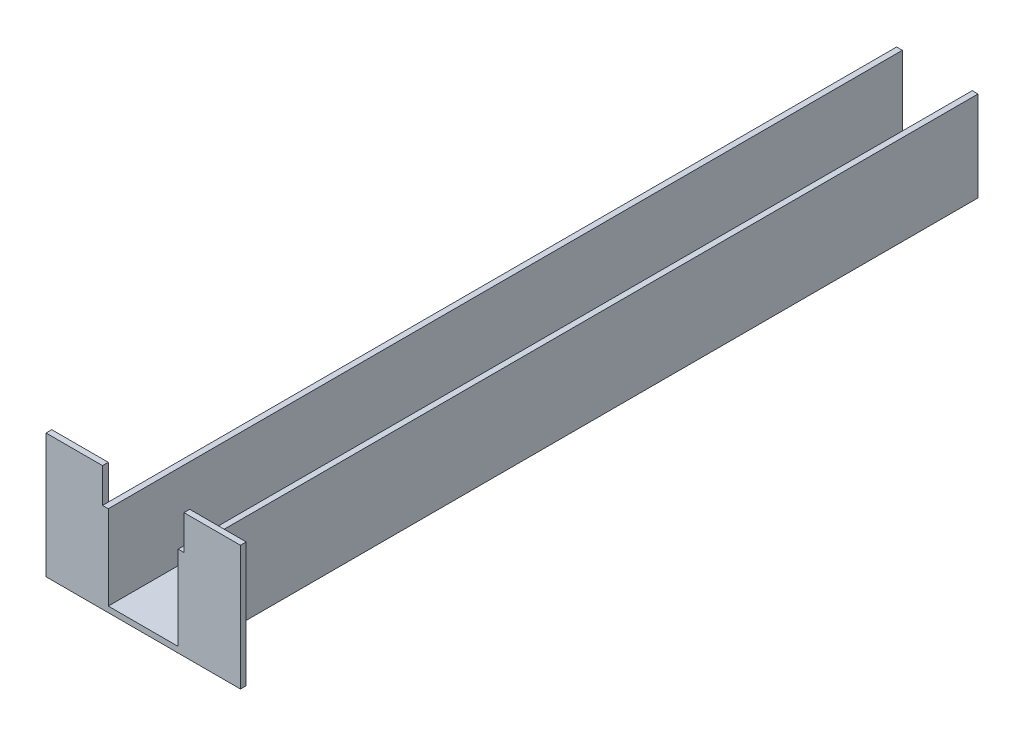
ISO-10303-21;
HEADER;
FILE_DESCRIPTION(('STEP AP214'),'2;1');
FILE_NAME('part.step','',(''),(''),'','','');
FILE_SCHEMA(('AUTOMOTIVE_DESIGN { 1 0 10303 214 1 1 1 1 }'));
ENDSEC;
DATA;
#1=APPLICATION_CONTEXT('core data for automotive mechanical design processes');
#2=APPLICATION_PROTOCOL_DEFINITION('international standard','automotive_design',2000,#1);
#3=PRODUCT_CONTEXT('',#1,'mechanical');
#4=PRODUCT('Part','Part','',(#3));
#5=PRODUCT_RELATED_PRODUCT_CATEGORY('part','',(#4));
#6=PRODUCT_DEFINITION_FORMATION('','',#4);
#7=PRODUCT_DEFINITION_CONTEXT('part definition',#1,'design');
#8=PRODUCT_DEFINITION('design','',#6,#7);
#9=PRODUCT_DEFINITION_SHAPE('','',#8);
#10=(LENGTH_UNIT() NAMED_UNIT(*) SI_UNIT(.MILLI.,.METRE.));
#11=(NAMED_UNIT(*) PLANE_ANGLE_UNIT() SI_UNIT($,.RADIAN.));
#12=(NAMED_UNIT(*) SI_UNIT($,.STERADIAN.) SOLID_ANGLE_UNIT());
#13=UNCERTAINTY_MEASURE_WITH_UNIT(LENGTH_MEASURE(1.E-05),#10,'distance_accuracy_value','');
#14=(GEOMETRIC_REPRESENTATION_CONTEXT(3) GLOBAL_UNCERTAINTY_ASSIGNED_CONTEXT((#13)) GLOBAL_UNIT_ASSIGNED_CONTEXT((#10,
#11,#12)) REPRESENTATION_CONTEXT('',''));
#15=CARTESIAN_POINT('',(0.,0.,0.));
#16=DIRECTION('',(0.,0.,1.));
#17=DIRECTION('',(1.,0.,0.));
#18=AXIS2_PLACEMENT_3D('',#15,#16,#17);
#19=CARTESIAN_POINT('',(-10.795,23.876,210.566));
#20=DIRECTION('',(0.,-1.,0.));
#21=DIRECTION('',(0.,0.,-1.));
#22=AXIS2_PLACEMENT_3D('',#19,#20,#21);
#23=PLANE('',#22);
#24=DIRECTION('',(0.,0.,1.));
#25=VECTOR('',#24,1.);
#26=CARTESIAN_POINT('',(-10.795,23.876,104.521));
#27=LINE('',#26,#25);
#28=CARTESIAN_POINT('',(-10.795,23.876,0.));
#29=VERTEX_POINT('',#28);
#30=CARTESIAN_POINT('',(-10.795,23.8759999996825,209.041999969012));
#31=VERTEX_POINT('',#30);
#32=EDGE_CURVE('E140',#29,#31,#27,.T.);
#33=ORIENTED_EDGE('',*,*,#32,.T.);
#34=DIRECTION('',(0.,0.,-1.));
#35=VECTOR('',#34,1.);
#36=CARTESIAN_POINT('',(-10.795,23.876,209.804));
#37=LINE('',#36,#35);
#38=CARTESIAN_POINT('',(-10.795000001143,23.875999999365,210.566));
#39=VERTEX_POINT('',#38);
#40=EDGE_CURVE('E128',#39,#31,#37,.T.);
#41=ORIENTED_EDGE('',*,*,#40,.F.);
#42=DIRECTION('',(-1.,0.,0.));
#43=VECTOR('',#42,1.);
#44=CARTESIAN_POINT('',(-10.033,23.876,210.566));
#45=LINE('',#44,#43);
#46=CARTESIAN_POINT('',(-9.271000004318,23.875999999365,210.566));
#47=VERTEX_POINT('',#46);
#48=EDGE_CURVE('E20',#47,#39,#45,.T.);
#49=ORIENTED_EDGE('',*,*,#48,.F.);
#50=DIRECTION('',(0.,0.,-1.));
#51=VECTOR('',#50,1.);
#52=CARTESIAN_POINT('',(-9.271,23.876,105.283));
#53=LINE('',#52,#51);
#54=CARTESIAN_POINT('',(-9.2710000015875,23.876,0.));
#55=VERTEX_POINT('',#54);
#56=EDGE_CURVE('E169',#47,#55,#53,.T.);
#57=ORIENTED_EDGE('',*,*,#56,.T.);
#58=DIRECTION('',(1.,0.,0.));
#59=VECTOR('',#58,1.);
#60=CARTESIAN_POINT('',(-10.033,23.876,0.));
#61=LINE('',#60,#59);
#62=EDGE_CURVE('E142',#29,#55,#61,.T.);
#63=ORIENTED_EDGE('',*,*,#62,.F.);
#64=EDGE_LOOP('',(#33,#41,#49,#57,#63));
#65=FACE_BOUND('',#64,.T.);
#66=ADVANCED_FACE('F16',(#65),#23,.F.);
#67=CARTESIAN_POINT('',(-25.781,33.02,209.042));
#68=DIRECTION('',(1.,0.,0.));
#69=DIRECTION('',(0.,0.,1.));
#70=AXIS2_PLACEMENT_3D('',#67,#68,#69);
#71=PLANE('',#70);
#72=DIRECTION('',(0.,0.,1.));
#73=VECTOR('',#72,1.);
#74=CARTESIAN_POINT('',(-25.781,33.02,209.804));
#75=LINE('',#74,#73);
#76=CARTESIAN_POINT('',(-25.781,33.02,209.042));
#77=VERTEX_POINT('',#76);
#78=CARTESIAN_POINT('',(-25.781,33.02,210.566));
#79=VERTEX_POINT('',#78);
#80=EDGE_CURVE('E137',#77,#79,#75,.T.);
#81=ORIENTED_EDGE('',*,*,#80,.F.);
#82=DIRECTION('',(0.,1.,0.));
#83=VECTOR('',#82,1.);
#84=CARTESIAN_POINT('',(-25.781,16.51,209.042));
#85=LINE('',#84,#83);
#86=CARTESIAN_POINT('',(-25.781,0.,209.041999984506));
#87=VERTEX_POINT('',#86);
#88=EDGE_CURVE('E121',#87,#77,#85,.T.);
#89=ORIENTED_EDGE('',*,*,#88,.F.);
#90=DIRECTION('',(0.,0.,-1.));
#91=VECTOR('',#90,1.);
#92=CARTESIAN_POINT('',(-25.781,0.,209.804));
#93=LINE('',#92,#91);
#94=CARTESIAN_POINT('',(-25.781,0.,210.566));
#95=VERTEX_POINT('',#94);
#96=EDGE_CURVE('E173',#95,#87,#93,.T.);
#97=ORIENTED_EDGE('',*,*,#96,.F.);
#98=DIRECTION('',(0.,1.,0.));
#99=VECTOR('',#98,1.);
#100=CARTESIAN_POINT('',(-25.781,16.51,210.566));
#101=LINE('',#100,#99);
#102=EDGE_CURVE('E155',#95,#79,#101,.T.);
#103=ORIENTED_EDGE('',*,*,#102,.T.);
#104=EDGE_LOOP('',(#81,#89,#97,#103));
#105=FACE_BOUND('',#104,.T.);
#106=ADVANCED_FACE('F230',(#105),#71,.F.);
#107=CARTESIAN_POINT('',(-25.781,33.02,209.042));
#108=DIRECTION('',(0.,1.,0.));
#109=DIRECTION('',(0.,0.,1.));
#110=AXIS2_PLACEMENT_3D('',#107,#108,#109);
#111=PLANE('',#110);
#112=ORIENTED_EDGE('',*,*,#80,.T.);
#113=DIRECTION('',(1.,0.,0.));
#114=VECTOR('',#113,1.);
#115=CARTESIAN_POINT('',(0.,33.02,210.566));
#116=LINE('',#115,#114);
#117=CARTESIAN_POINT('',(-10.795000001143,33.02,210.566));
#118=VERTEX_POINT('',#117);
#119=EDGE_CURVE('E225',#79,#118,#116,.T.);
#120=ORIENTED_EDGE('',*,*,#119,.T.);
#121=DIRECTION('',(0.,0.,1.));
#122=VECTOR('',#121,1.);
#123=CARTESIAN_POINT('',(-10.795,33.02,209.804));
#124=LINE('',#123,#122);
#125=CARTESIAN_POINT('',(-10.795,33.02,209.042));
#126=VERTEX_POINT('',#125);
#127=EDGE_CURVE('E136',#126,#118,#124,.T.);
#128=ORIENTED_EDGE('',*,*,#127,.F.);
#129=DIRECTION('',(1.,0.,0.));
#130=VECTOR('',#129,1.);
#131=CARTESIAN_POINT('',(-18.288,33.02,209.042));
#132=LINE('',#131,#130);
#133=EDGE_CURVE('E153',#77,#126,#132,.T.);
#134=ORIENTED_EDGE('',*,*,#133,.F.);
#135=EDGE_LOOP('',(#112,#120,#128,#134));
#136=FACE_BOUND('',#135,.T.);
#137=ADVANCED_FACE('F409',(#136),#111,.T.);
#138=CARTESIAN_POINT('',(-10.795,33.02,209.042));
#139=DIRECTION('',(1.,0.,0.));
#140=DIRECTION('',(0.,0.,1.));
#141=AXIS2_PLACEMENT_3D('',#138,#139,#140);
#142=PLANE('',#141);
#143=DIRECTION('',(0.,-1.,0.));
#144=VECTOR('',#143,1.);
#145=CARTESIAN_POINT('',(-10.795,16.51,209.042));
#146=LINE('',#145,#144);
#147=EDGE_CURVE('E132',#126,#31,#146,.T.);
#148=ORIENTED_EDGE('',*,*,#147,.F.);
#149=ORIENTED_EDGE('',*,*,#127,.T.);
#150=DIRECTION('',(0.,-1.,0.));
#151=VECTOR('',#150,1.);
#152=CARTESIAN_POINT('',(-10.795000004572,16.51,210.566));
#153=LINE('',#152,#151);
#154=EDGE_CURVE('E134',#118,#39,#153,.T.);
#155=ORIENTED_EDGE('',*,*,#154,.T.);
#156=ORIENTED_EDGE('',*,*,#40,.T.);
#157=EDGE_LOOP('',(#148,#149,#155,#156));
#158=FACE_BOUND('',#157,.T.);
#159=ADVANCED_FACE('F130',(#158),#142,.T.);
#160=CARTESIAN_POINT('',(-9.271,1.524,0.));
#161=DIRECTION('',(-1.,0.,0.));
#162=DIRECTION('',(0.,0.,1.));
#163=AXIS2_PLACEMENT_3D('',#160,#161,#162);
#164=PLANE('',#163);
#165=ORIENTED_EDGE('',*,*,#56,.F.);
#166=DIRECTION('',(0.,-1.,0.));
#167=VECTOR('',#166,1.);
#168=CARTESIAN_POINT('',(-9.27100001727201,16.51,210.566));
#169=LINE('',#168,#167);
#170=CARTESIAN_POINT('',(-9.271000004318,1.52399999873,210.566));
#171=VERTEX_POINT('',#170);
#172=EDGE_CURVE('E182',#47,#171,#169,.T.);
#173=ORIENTED_EDGE('',*,*,#172,.T.);
#174=DIRECTION('',(0.,0.,-1.));
#175=VECTOR('',#174,1.);
#176=CARTESIAN_POINT('',(-9.271,1.524,105.283));
#177=LINE('',#176,#175);
#178=CARTESIAN_POINT('',(-9.2710000015875,1.523999998603,0.));
#179=VERTEX_POINT('',#178);
#180=EDGE_CURVE('E166',#171,#179,#177,.T.);
#181=ORIENTED_EDGE('',*,*,#180,.T.);
#182=DIRECTION('',(0.,-1.,0.));
#183=VECTOR('',#182,1.);
#184=CARTESIAN_POINT('',(-9.27100000635,11.938,0.));
#185=LINE('',#184,#183);
#186=EDGE_CURVE('E187',#55,#179,#185,.T.);
#187=ORIENTED_EDGE('',*,*,#186,.F.);
#188=EDGE_LOOP('',(#165,#173,#181,#187));
#189=FACE_BOUND('',#188,.T.);
#190=ADVANCED_FACE('F186',(#189),#164,.F.);
#191=CARTESIAN_POINT('',(-9.271,1.524,210.566));
#192=DIRECTION('',(0.,-1.,0.));
#193=DIRECTION('',(0.,0.,-1.));
#194=AXIS2_PLACEMENT_3D('',#191,#192,#193);
#195=PLANE('',#194);
#196=ORIENTED_EDGE('',*,*,#180,.F.);
#197=DIRECTION('',(1.,0.,0.));
#198=VECTOR('',#197,1.);
#199=CARTESIAN_POINT('',(0.,1.52399999492,210.566));
#200=LINE('',#199,#198);
#201=CARTESIAN_POINT('',(9.271000004318,1.52399999873,210.566));
#202=VERTEX_POINT('',#201);
#203=EDGE_CURVE('E220',#171,#202,#200,.T.);
#204=ORIENTED_EDGE('',*,*,#203,.T.);
#205=DIRECTION('',(0.,0.,-1.));
#206=VECTOR('',#205,1.);
#207=CARTESIAN_POINT('',(9.271,1.524,105.283));
#208=LINE('',#207,#206);
#209=CARTESIAN_POINT('',(9.2710000015875,1.523999998603,0.));
#210=VERTEX_POINT('',#209);
#211=EDGE_CURVE('E148',#202,#210,#208,.T.);
#212=ORIENTED_EDGE('',*,*,#211,.T.);
#213=DIRECTION('',(1.,0.,0.));
#214=VECTOR('',#213,1.);
#215=CARTESIAN_POINT('',(0.,1.523999994412,0.));
#216=LINE('',#215,#214);
#217=EDGE_CURVE('E189',#179,#210,#216,.T.);
#218=ORIENTED_EDGE('',*,*,#217,.F.);
#219=EDGE_LOOP('',(#196,#204,#212,#218));
#220=FACE_BOUND('',#219,.T.);
#221=ADVANCED_FACE('F386',(#220),#195,.F.);
#222=CARTESIAN_POINT('',(9.271,1.524,210.566));
#223=DIRECTION('',(1.,0.,0.));
#224=DIRECTION('',(0.,0.,-1.));
#225=AXIS2_PLACEMENT_3D('',#222,#223,#224);
#226=PLANE('',#225);
#227=ORIENTED_EDGE('',*,*,#211,.F.);
#228=DIRECTION('',(0.,1.,0.));
#229=VECTOR('',#228,1.);
#230=CARTESIAN_POINT('',(9.271000017272,16.51,210.566));
#231=LINE('',#230,#229);
#232=CARTESIAN_POINT('',(9.271000008636,23.87599999873,210.566));
#233=VERTEX_POINT('',#232);
#234=EDGE_CURVE('E218',#202,#233,#231,.T.);
#235=ORIENTED_EDGE('',*,*,#234,.T.);
#236=DIRECTION('',(0.,0.,-1.));
#237=VECTOR('',#236,1.);
#238=CARTESIAN_POINT('',(9.271,23.876,105.283));
#239=LINE('',#238,#237);
#240=CARTESIAN_POINT('',(9.2710000015875,23.876,0.));
#241=VERTEX_POINT('',#240);
#242=EDGE_CURVE('E194',#233,#241,#239,.T.);
#243=ORIENTED_EDGE('',*,*,#242,.T.);
#244=DIRECTION('',(0.,1.,0.));
#245=VECTOR('',#244,1.);
#246=CARTESIAN_POINT('',(9.27100000635,11.938,0.));
#247=LINE('',#246,#245);
#248=EDGE_CURVE('E192',#210,#241,#247,.T.);
#249=ORIENTED_EDGE('',*,*,#248,.F.);
#250=EDGE_LOOP('',(#227,#235,#243,#249));
#251=FACE_BOUND('',#250,.T.);
#252=ADVANCED_FACE('F255',(#251),#226,.F.);
#253=CARTESIAN_POINT('',(-10.795,0.,209.042));
#254=DIRECTION('',(1.,0.,0.));
#255=DIRECTION('',(0.,0.,-1.));
#256=AXIS2_PLACEMENT_3D('',#253,#254,#255);
#257=PLANE('',#256);
#258=DIRECTION('',(0.,-1.,0.));
#259=VECTOR('',#258,1.);
#260=CARTESIAN_POINT('',(-10.795,16.51,209.042));
#261=LINE('',#260,#259);
#262=CARTESIAN_POINT('',(-10.795000001143,0.,209.041999984506));
#263=VERTEX_POINT('',#262);
#264=EDGE_CURVE('E147',#31,#263,#261,.T.);
#265=ORIENTED_EDGE('',*,*,#264,.F.);
#266=ORIENTED_EDGE('',*,*,#32,.F.);
#267=DIRECTION('',(0.,1.,0.));
#268=VECTOR('',#267,1.);
#269=CARTESIAN_POINT('',(-10.795,11.938,0.));
#270=LINE('',#269,#268);
#271=CARTESIAN_POINT('',(-10.795000001143,0.,0.));
#272=VERTEX_POINT('',#271);
#273=EDGE_CURVE('E190',#272,#29,#270,.T.);
#274=ORIENTED_EDGE('',*,*,#273,.F.);
#275=DIRECTION('',(0.,0.,1.));
#276=VECTOR('',#275,1.);
#277=CARTESIAN_POINT('',(-10.795000004572,0.,105.283));
#278=LINE('',#277,#276);
#279=EDGE_CURVE('E159',#272,#263,#278,.T.);
#280=ORIENTED_EDGE('',*,*,#279,.T.);
#281=EDGE_LOOP('',(#265,#266,#274,#280));
#282=FACE_BOUND('',#281,.T.);
#283=ADVANCED_FACE('F158',(#282),#257,.F.);
#284=CARTESIAN_POINT('',(-10.795,0.,209.042));
#285=DIRECTION('',(0.,0.,-1.));
#286=DIRECTION('',(-1.,0.,0.));
#287=AXIS2_PLACEMENT_3D('',#284,#285,#286);
#288=PLANE('',#287);
#289=ORIENTED_EDGE('',*,*,#133,.T.);
#290=ORIENTED_EDGE('',*,*,#147,.T.);
#291=ORIENTED_EDGE('',*,*,#264,.T.);
#292=DIRECTION('',(-1.,0.,0.));
#293=VECTOR('',#292,1.);
#294=CARTESIAN_POINT('',(0.,0.,209.041999938024));
#295=LINE('',#294,#293);
#296=EDGE_CURVE('E239',#263,#87,#295,.T.);
#297=ORIENTED_EDGE('',*,*,#296,.T.);
#298=ORIENTED_EDGE('',*,*,#88,.T.);
#299=EDGE_LOOP('',(#289,#290,#291,#297,#298));
#300=FACE_BOUND('',#299,.T.);
#301=ADVANCED_FACE('F150',(#300),#288,.T.);
#302=CARTESIAN_POINT('',(25.781,0.,210.566));
#303=DIRECTION('',(0.,0.,-1.));
#304=DIRECTION('',(-1.,0.,0.));
#305=AXIS2_PLACEMENT_3D('',#302,#303,#304);
#306=PLANE('',#305);
#307=DIRECTION('',(0.,1.,0.));
#308=VECTOR('',#307,1.);
#309=CARTESIAN_POINT('',(25.781,16.51,210.566));
#310=LINE('',#309,#308);
#311=CARTESIAN_POINT('',(25.781,0.,210.566));
#312=VERTEX_POINT('',#311);
#313=CARTESIAN_POINT('',(25.781,33.02,210.566));
#314=VERTEX_POINT('',#313);
#315=EDGE_CURVE('E216',#312,#314,#310,.T.);
#316=ORIENTED_EDGE('',*,*,#315,.T.);
#317=DIRECTION('',(-1.,0.,0.));
#318=VECTOR('',#317,1.);
#319=CARTESIAN_POINT('',(18.288,33.02,210.566));
#320=LINE('',#319,#318);
#321=CARTESIAN_POINT('',(10.795000002286,33.02,210.566));
#322=VERTEX_POINT('',#321);
#323=EDGE_CURVE('E210',#314,#322,#320,.T.);
#324=ORIENTED_EDGE('',*,*,#323,.T.);
#325=DIRECTION('',(0.,1.,0.));
#326=VECTOR('',#325,1.);
#327=CARTESIAN_POINT('',(10.795,28.448,210.566));
#328=LINE('',#327,#326);
#329=CARTESIAN_POINT('',(10.795000001143,23.875999999365,210.566));
#330=VERTEX_POINT('',#329);
#331=EDGE_CURVE('E208',#330,#322,#328,.T.);
#332=ORIENTED_EDGE('',*,*,#331,.F.);
#333=DIRECTION('',(-1.,0.,0.));
#334=VECTOR('',#333,1.);
#335=CARTESIAN_POINT('',(10.033,23.876,210.566));
#336=LINE('',#335,#334);
#337=EDGE_CURVE('E200',#330,#233,#336,.T.);
#338=ORIENTED_EDGE('',*,*,#337,.T.);
#339=ORIENTED_EDGE('',*,*,#234,.F.);
#340=ORIENTED_EDGE('',*,*,#203,.F.);
#341=ORIENTED_EDGE('',*,*,#172,.F.);
#342=ORIENTED_EDGE('',*,*,#48,.T.);
#343=ORIENTED_EDGE('',*,*,#154,.F.);
#344=ORIENTED_EDGE('',*,*,#119,.F.);
#345=ORIENTED_EDGE('',*,*,#102,.F.);
#346=DIRECTION('',(1.,0.,0.));
#347=VECTOR('',#346,1.);
#348=CARTESIAN_POINT('',(0.,0.,210.566));
#349=LINE('',#348,#347);
#350=EDGE_CURVE('E233',#95,#312,#349,.T.);
#351=ORIENTED_EDGE('',*,*,#350,.T.);
#352=EDGE_LOOP('',(#316,#324,#332,#338,#339,#340,#341,#342,#343,#344,#345,#351));
#353=FACE_BOUND('',#352,.T.);
#354=ADVANCED_FACE('F177',(#353),#306,.F.);
#355=CARTESIAN_POINT('',(25.781,0.,209.042));
#356=DIRECTION('',(-1.,0.,0.));
#357=DIRECTION('',(0.,0.,1.));
#358=AXIS2_PLACEMENT_3D('',#355,#356,#357);
#359=PLANE('',#358);
#360=DIRECTION('',(0.,0.,-1.));
#361=VECTOR('',#360,1.);
#362=CARTESIAN_POINT('',(25.781,0.,105.283));
#363=LINE('',#362,#361);
#364=CARTESIAN_POINT('',(25.781,0.,209.041999969012));
#365=VERTEX_POINT('',#364);
#366=EDGE_CURVE('E238',#312,#365,#363,.T.);
#367=ORIENTED_EDGE('',*,*,#366,.T.);
#368=DIRECTION('',(0.,1.,0.));
#369=VECTOR('',#368,1.);
#370=CARTESIAN_POINT('',(25.781,16.51,209.042));
#371=LINE('',#370,#369);
#372=CARTESIAN_POINT('',(25.781,33.02,209.042));
#373=VERTEX_POINT('',#372);
#374=EDGE_CURVE('E275',#365,#373,#371,.T.);
#375=ORIENTED_EDGE('',*,*,#374,.T.);
#376=DIRECTION('',(0.,0.,1.));
#377=VECTOR('',#376,1.);
#378=CARTESIAN_POINT('',(25.781,33.02,209.804));
#379=LINE('',#378,#377);
#380=EDGE_CURVE('E213',#373,#314,#379,.T.);
#381=ORIENTED_EDGE('',*,*,#380,.T.);
#382=ORIENTED_EDGE('',*,*,#315,.F.);
#383=EDGE_LOOP('',(#367,#375,#381,#382));
#384=FACE_BOUND('',#383,.T.);
#385=ADVANCED_FACE('F289',(#384),#359,.F.);
#386=CARTESIAN_POINT('',(10.795,33.02,210.566));
#387=DIRECTION('',(0.,-1.,0.));
#388=DIRECTION('',(0.,0.,-1.));
#389=AXIS2_PLACEMENT_3D('',#386,#387,#388);
#390=PLANE('',#389);
#391=ORIENTED_EDGE('',*,*,#323,.F.);
#392=ORIENTED_EDGE('',*,*,#380,.F.);
#393=DIRECTION('',(-1.,0.,0.));
#394=VECTOR('',#393,1.);
#395=CARTESIAN_POINT('',(18.288,33.02,209.042));
#396=LINE('',#395,#394);
#397=CARTESIAN_POINT('',(10.795,33.02,209.042));
#398=VERTEX_POINT('',#397);
#399=EDGE_CURVE('E269',#373,#398,#396,.T.);
#400=ORIENTED_EDGE('',*,*,#399,.T.);
#401=DIRECTION('',(0.,0.,-1.));
#402=VECTOR('',#401,1.);
#403=CARTESIAN_POINT('',(10.795,33.02,209.804));
#404=LINE('',#403,#402);
#405=EDGE_CURVE('E206',#322,#398,#404,.T.);
#406=ORIENTED_EDGE('',*,*,#405,.F.);
#407=EDGE_LOOP('',(#391,#392,#400,#406));
#408=FACE_BOUND('',#407,.T.);
#409=ADVANCED_FACE('F287',(#408),#390,.F.);
#410=CARTESIAN_POINT('',(10.795,23.876,209.042));
#411=DIRECTION('',(-1.,0.,0.));
#412=DIRECTION('',(0.,0.,1.));
#413=AXIS2_PLACEMENT_3D('',#410,#411,#412);
#414=PLANE('',#413);
#415=ORIENTED_EDGE('',*,*,#405,.T.);
#416=DIRECTION('',(0.,-1.,0.));
#417=VECTOR('',#416,1.);
#418=CARTESIAN_POINT('',(10.795,16.51,209.042));
#419=LINE('',#418,#417);
#420=CARTESIAN_POINT('',(10.795,23.8759999996825,209.041999984506));
#421=VERTEX_POINT('',#420);
#422=EDGE_CURVE('E266',#398,#421,#419,.T.);
#423=ORIENTED_EDGE('',*,*,#422,.T.);
#424=DIRECTION('',(0.,0.,1.));
#425=VECTOR('',#424,1.);
#426=CARTESIAN_POINT('',(10.795,23.876,105.283));
#427=LINE('',#426,#425);
#428=EDGE_CURVE('E203',#421,#330,#427,.T.);
#429=ORIENTED_EDGE('',*,*,#428,.T.);
#430=ORIENTED_EDGE('',*,*,#331,.T.);
#431=EDGE_LOOP('',(#415,#423,#429,#430));
#432=FACE_BOUND('',#431,.T.);
#433=ADVANCED_FACE('F290',(#432),#414,.T.);
#434=CARTESIAN_POINT('',(9.271,23.876,210.566));
#435=DIRECTION('',(0.,-1.,0.));
#436=DIRECTION('',(0.,0.,-1.));
#437=AXIS2_PLACEMENT_3D('',#434,#435,#436);
#438=PLANE('',#437);
#439=ORIENTED_EDGE('',*,*,#242,.F.);
#440=ORIENTED_EDGE('',*,*,#337,.F.);
#441=ORIENTED_EDGE('',*,*,#428,.F.);
#442=DIRECTION('',(0.,0.,-1.));
#443=VECTOR('',#442,1.);
#444=CARTESIAN_POINT('',(10.795,23.876,104.521));
#445=LINE('',#444,#443);
#446=CARTESIAN_POINT('',(10.795,23.876,0.));
#447=VERTEX_POINT('',#446);
#448=EDGE_CURVE('E262',#421,#447,#445,.T.);
#449=ORIENTED_EDGE('',*,*,#448,.T.);
#450=DIRECTION('',(1.,0.,0.));
#451=VECTOR('',#450,1.);
#452=CARTESIAN_POINT('',(0.,23.876,0.));
#453=LINE('',#452,#451);
#454=EDGE_CURVE('E247',#241,#447,#453,.T.);
#455=ORIENTED_EDGE('',*,*,#454,.F.);
#456=EDGE_LOOP('',(#439,#440,#441,#449,#455));
#457=FACE_BOUND('',#456,.T.);
#458=ADVANCED_FACE('F260',(#457),#438,.F.);
#459=CARTESIAN_POINT('',(10.795,0.,0.));
#460=DIRECTION('',(0.,0.,-1.));
#461=DIRECTION('',(-1.,0.,0.));
#462=AXIS2_PLACEMENT_3D('',#459,#460,#461);
#463=PLANE('',#462);
#464=ORIENTED_EDGE('',*,*,#454,.T.);
#465=DIRECTION('',(0.,-1.,0.));
#466=VECTOR('',#465,1.);
#467=CARTESIAN_POINT('',(10.795,11.938,0.));
#468=LINE('',#467,#466);
#469=CARTESIAN_POINT('',(10.795000001143,0.,0.));
#470=VERTEX_POINT('',#469);
#471=EDGE_CURVE('E265',#447,#470,#468,.T.);
#472=ORIENTED_EDGE('',*,*,#471,.T.);
#473=DIRECTION('',(-1.,0.,0.));
#474=VECTOR('',#473,1.);
#475=CARTESIAN_POINT('',(0.,0.,0.));
#476=LINE('',#475,#474);
#477=EDGE_CURVE('E241',#470,#272,#476,.T.);
#478=ORIENTED_EDGE('',*,*,#477,.T.);
#479=ORIENTED_EDGE('',*,*,#273,.T.);
#480=ORIENTED_EDGE('',*,*,#62,.T.);
#481=ORIENTED_EDGE('',*,*,#186,.T.);
#482=ORIENTED_EDGE('',*,*,#217,.T.);
#483=ORIENTED_EDGE('',*,*,#248,.T.);
#484=EDGE_LOOP('',(#464,#472,#478,#479,#480,#481,#482,#483));
#485=FACE_BOUND('',#484,.T.);
#486=ADVANCED_FACE('F249',(#485),#463,.T.);
#487=CARTESIAN_POINT('',(-25.781,0.,0.));
#488=DIRECTION('',(0.,1.,0.));
#489=DIRECTION('',(0.,0.,1.));
#490=AXIS2_PLACEMENT_3D('',#487,#488,#489);
#491=PLANE('',#490);
#492=DIRECTION('',(0.,0.,1.));
#493=VECTOR('',#492,1.);
#494=CARTESIAN_POINT('',(10.795,0.,104.521));
#495=LINE('',#494,#493);
#496=CARTESIAN_POINT('',(10.795000002286,0.,209.041999969012));
#497=VERTEX_POINT('',#496);
#498=EDGE_CURVE('E26',#470,#497,#495,.T.);
#499=ORIENTED_EDGE('',*,*,#498,.T.);
#500=DIRECTION('',(1.,0.,0.));
#501=VECTOR('',#500,1.);
#502=CARTESIAN_POINT('',(18.288,0.,209.042));
#503=LINE('',#502,#501);
#504=EDGE_CURVE('E34',#497,#365,#503,.T.);
#505=ORIENTED_EDGE('',*,*,#504,.T.);
#506=ORIENTED_EDGE('',*,*,#366,.F.);
#507=ORIENTED_EDGE('',*,*,#350,.F.);
#508=ORIENTED_EDGE('',*,*,#96,.T.);
#509=ORIENTED_EDGE('',*,*,#296,.F.);
#510=ORIENTED_EDGE('',*,*,#279,.F.);
#511=ORIENTED_EDGE('',*,*,#477,.F.);
#512=EDGE_LOOP('',(#499,#505,#506,#507,#508,#509,#510,#511));
#513=FACE_BOUND('',#512,.T.);
#514=ADVANCED_FACE('F237',(#513),#491,.F.);
#515=CARTESIAN_POINT('',(10.795,0.,209.042));
#516=DIRECTION('',(0.,0.,1.));
#517=DIRECTION('',(1.,0.,0.));
#518=AXIS2_PLACEMENT_3D('',#515,#516,#517);
#519=PLANE('',#518);
#520=ORIENTED_EDGE('',*,*,#422,.F.);
#521=ORIENTED_EDGE('',*,*,#399,.F.);
#522=ORIENTED_EDGE('',*,*,#374,.F.);
#523=ORIENTED_EDGE('',*,*,#504,.F.);
#524=DIRECTION('',(0.,1.,0.));
#525=VECTOR('',#524,1.);
#526=CARTESIAN_POINT('',(10.795,11.938,209.042));
#527=LINE('',#526,#525);
#528=EDGE_CURVE('E11',#497,#421,#527,.T.);
#529=ORIENTED_EDGE('',*,*,#528,.T.);
#530=EDGE_LOOP('',(#520,#521,#522,#523,#529));
#531=FACE_BOUND('',#530,.T.);
#532=ADVANCED_FACE('F281',(#531),#519,.F.);
#533=CARTESIAN_POINT('',(10.795,0.,0.));
#534=DIRECTION('',(-1.,0.,0.));
#535=DIRECTION('',(0.,0.,1.));
#536=AXIS2_PLACEMENT_3D('',#533,#534,#535);
#537=PLANE('',#536);
#538=ORIENTED_EDGE('',*,*,#498,.F.);
#539=ORIENTED_EDGE('',*,*,#471,.F.);
#540=ORIENTED_EDGE('',*,*,#448,.F.);
#541=ORIENTED_EDGE('',*,*,#528,.F.);
#542=EDGE_LOOP('',(#538,#539,#540,#541));
#543=FACE_BOUND('',#542,.T.);
#544=ADVANCED_FACE('F18',(#543),#537,.F.);
#545=CLOSED_SHELL('',(#66,#106,#137,#159,#190,#221,#252,#283,#301,#354,#385,#409,#433,#458,#486,
#514,#532,#544));
#546=MANIFOLD_SOLID_BREP('B1',#545);
#547=ADVANCED_BREP_SHAPE_REPRESENTATION('',(#18,#546),#14);
#548=SHAPE_DEFINITION_REPRESENTATION(#9,#547);
ENDSEC;
END-ISO-10303-21;
